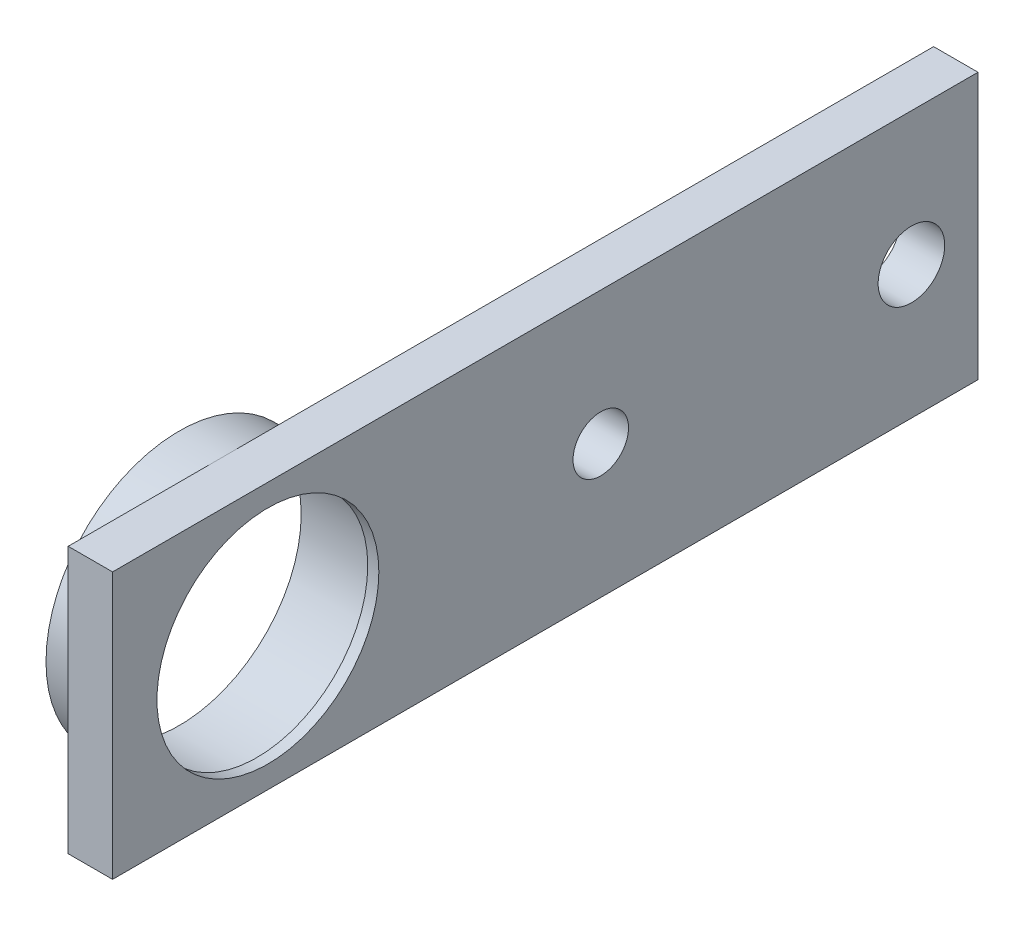
ISO-10303-21;
HEADER;
FILE_DESCRIPTION(('STEP AP214'),'2;1');
FILE_NAME('part.step','',(''),(''),'','','');
FILE_SCHEMA(('AUTOMOTIVE_DESIGN { 1 0 10303 214 1 1 1 1 }'));
ENDSEC;
DATA;
#1=APPLICATION_CONTEXT('core data for automotive mechanical design processes');
#2=APPLICATION_PROTOCOL_DEFINITION('international standard','automotive_design',2000,#1);
#3=PRODUCT_CONTEXT('',#1,'mechanical');
#4=PRODUCT('Part','Part','',(#3));
#5=PRODUCT_RELATED_PRODUCT_CATEGORY('part','',(#4));
#6=PRODUCT_DEFINITION_FORMATION('','',#4);
#7=PRODUCT_DEFINITION_CONTEXT('part definition',#1,'design');
#8=PRODUCT_DEFINITION('design','',#6,#7);
#9=PRODUCT_DEFINITION_SHAPE('','',#8);
#10=(LENGTH_UNIT() NAMED_UNIT(*) SI_UNIT(.MILLI.,.METRE.));
#11=(NAMED_UNIT(*) PLANE_ANGLE_UNIT() SI_UNIT($,.RADIAN.));
#12=(NAMED_UNIT(*) SI_UNIT($,.STERADIAN.) SOLID_ANGLE_UNIT());
#13=UNCERTAINTY_MEASURE_WITH_UNIT(LENGTH_MEASURE(1.E-05),#10,'distance_accuracy_value','');
#14=(GEOMETRIC_REPRESENTATION_CONTEXT(3) GLOBAL_UNCERTAINTY_ASSIGNED_CONTEXT((#13)) GLOBAL_UNIT_ASSIGNED_CONTEXT((#10,
#11,#12)) REPRESENTATION_CONTEXT('',''));
#15=CARTESIAN_POINT('',(0.,0.,0.));
#16=DIRECTION('',(0.,0.,1.));
#17=DIRECTION('',(1.,0.,0.));
#18=AXIS2_PLACEMENT_3D('',#15,#16,#17);
#19=CARTESIAN_POINT('',(0.,0.,0.));
#20=DIRECTION('',(-1.,0.,0.));
#21=DIRECTION('',(0.,0.,1.));
#22=AXIS2_PLACEMENT_3D('',#19,#20,#21);
#23=PLANE('',#22);
#24=CARTESIAN_POINT('',(0.,19.05,-22.225));
#25=DIRECTION('',(-1.,0.,0.));
#26=DIRECTION('',(0.,0.,1.));
#27=AXIS2_PLACEMENT_3D('',#24,#25,#26);
#28=CIRCLE('',#27,19.05);
#29=CARTESIAN_POINT('',(0.,38.1,-22.225));
#30=VERTEX_POINT('',#29);
#31=CARTESIAN_POINT('',(0.,0.,-22.225));
#32=VERTEX_POINT('',#31);
#33=EDGE_CURVE('E43',#30,#32,#28,.T.);
#34=ORIENTED_EDGE('',*,*,#33,.F.);
#35=DIRECTION('',(0.,0.,1.));
#36=VECTOR('',#35,1.);
#37=CARTESIAN_POINT('',(0.,38.1,0.));
#38=LINE('',#37,#36);
#39=CARTESIAN_POINT('',(0.,38.1,-123.825));
#40=VERTEX_POINT('',#39);
#41=EDGE_CURVE('E88',#40,#30,#38,.T.);
#42=ORIENTED_EDGE('',*,*,#41,.F.);
#43=DIRECTION('',(0.,1.,0.));
#44=VECTOR('',#43,1.);
#45=CARTESIAN_POINT('',(0.,0.,-123.825));
#46=LINE('',#45,#44);
#47=CARTESIAN_POINT('',(0.,0.,-123.825));
#48=VERTEX_POINT('',#47);
#49=EDGE_CURVE('E101',#48,#40,#46,.T.);
#50=ORIENTED_EDGE('',*,*,#49,.F.);
#51=DIRECTION('',(0.,0.,-1.));
#52=VECTOR('',#51,1.);
#53=CARTESIAN_POINT('',(0.,0.,0.));
#54=LINE('',#53,#52);
#55=EDGE_CURVE('E104',#32,#48,#54,.T.);
#56=ORIENTED_EDGE('',*,*,#55,.F.);
#57=EDGE_LOOP('',(#34,#42,#50,#56));
#58=FACE_BOUND('',#57,.T.);
#59=CARTESIAN_POINT('',(0.,19.05,-69.85));
#60=DIRECTION('',(1.,0.,0.));
#61=DIRECTION('',(0.,0.,-1.));
#62=AXIS2_PLACEMENT_3D('',#59,#60,#61);
#63=CIRCLE('',#62,3.96874999999999);
#64=CARTESIAN_POINT('',(0.,19.05,-73.81875));
#65=VERTEX_POINT('',#64);
#66=EDGE_CURVE('E179',#65,#65,#63,.T.);
#67=ORIENTED_EDGE('',*,*,#66,.T.);
#68=EDGE_LOOP('',(#67));
#69=FACE_BOUND('',#68,.T.);
#70=CARTESIAN_POINT('',(0.,19.05,-114.3));
#71=DIRECTION('',(1.,0.,0.));
#72=DIRECTION('',(0.,0.,-1.));
#73=AXIS2_PLACEMENT_3D('',#70,#71,#72);
#74=CIRCLE('',#73,4.7625);
#75=CARTESIAN_POINT('',(0.,19.05,-119.0625));
#76=VERTEX_POINT('',#75);
#77=EDGE_CURVE('E175',#76,#76,#74,.T.);
#78=ORIENTED_EDGE('',*,*,#77,.T.);
#79=EDGE_LOOP('',(#78));
#80=FACE_BOUND('',#79,.T.);
#81=ADVANCED_FACE('F33',(#58,#69,#80),#23,.T.);
#82=CARTESIAN_POINT('',(6.35,19.05,-22.225));
#83=DIRECTION('',(-1.,0.,0.));
#84=DIRECTION('',(0.,0.,1.));
#85=AXIS2_PLACEMENT_3D('',#82,#83,#84);
#86=CYLINDRICAL_SURFACE('',#85,17.4625);
#87=CARTESIAN_POINT('',(4.7625,19.05,-22.225));
#88=DIRECTION('',(1.,0.,0.));
#89=DIRECTION('',(0.,0.,-1.));
#90=AXIS2_PLACEMENT_3D('',#87,#88,#89);
#91=CIRCLE('',#90,17.4625);
#92=CARTESIAN_POINT('',(4.7625,19.05,-39.6875));
#93=VERTEX_POINT('',#92);
#94=EDGE_CURVE('E168',#93,#93,#91,.T.);
#95=ORIENTED_EDGE('',*,*,#94,.T.);
#96=EDGE_LOOP('',(#95));
#97=FACE_BOUND('',#96,.T.);
#98=CARTESIAN_POINT('',(-6.35,19.05,-22.225));
#99=DIRECTION('',(-1.,0.,0.));
#100=DIRECTION('',(0.,0.,1.));
#101=AXIS2_PLACEMENT_3D('',#98,#99,#100);
#102=CIRCLE('',#101,17.4625);
#103=CARTESIAN_POINT('',(-6.35,19.05,-4.7625));
#104=VERTEX_POINT('',#103);
#105=EDGE_CURVE('E108',#104,#104,#102,.T.);
#106=ORIENTED_EDGE('',*,*,#105,.T.);
#107=EDGE_LOOP('',(#106));
#108=FACE_BOUND('',#107,.T.);
#109=ADVANCED_FACE('F123',(#97,#108),#86,.F.);
#110=CARTESIAN_POINT('',(6.35,0.,0.));
#111=DIRECTION('',(-1.,0.,0.));
#112=DIRECTION('',(0.,0.,1.));
#113=AXIS2_PLACEMENT_3D('',#110,#111,#112);
#114=PLANE('',#113);
#115=DIRECTION('',(0.,-1.,0.));
#116=VECTOR('',#115,1.);
#117=CARTESIAN_POINT('',(6.35,0.,0.));
#118=LINE('',#117,#116);
#119=CARTESIAN_POINT('',(6.35,38.1,0.));
#120=VERTEX_POINT('',#119);
#121=CARTESIAN_POINT('',(6.35,0.,0.));
#122=VERTEX_POINT('',#121);
#123=EDGE_CURVE('E95',#120,#122,#118,.T.);
#124=ORIENTED_EDGE('',*,*,#123,.T.);
#125=DIRECTION('',(0.,0.,-1.));
#126=VECTOR('',#125,1.);
#127=CARTESIAN_POINT('',(6.35,0.,0.));
#128=LINE('',#127,#126);
#129=CARTESIAN_POINT('',(6.35,0.,-123.825));
#130=VERTEX_POINT('',#129);
#131=EDGE_CURVE('E84',#122,#130,#128,.T.);
#132=ORIENTED_EDGE('',*,*,#131,.T.);
#133=DIRECTION('',(0.,1.,0.));
#134=VECTOR('',#133,1.);
#135=CARTESIAN_POINT('',(6.35,0.,-123.825));
#136=LINE('',#135,#134);
#137=CARTESIAN_POINT('',(6.35,38.1,-123.825));
#138=VERTEX_POINT('',#137);
#139=EDGE_CURVE('E189',#130,#138,#136,.T.);
#140=ORIENTED_EDGE('',*,*,#139,.T.);
#141=DIRECTION('',(0.,0.,1.));
#142=VECTOR('',#141,1.);
#143=CARTESIAN_POINT('',(6.35,38.1,0.));
#144=LINE('',#143,#142);
#145=EDGE_CURVE('E57',#138,#120,#144,.T.);
#146=ORIENTED_EDGE('',*,*,#145,.T.);
#147=EDGE_LOOP('',(#124,#132,#140,#146));
#148=FACE_BOUND('',#147,.T.);
#149=CARTESIAN_POINT('',(6.35,19.05,-69.85));
#150=DIRECTION('',(1.,0.,0.));
#151=DIRECTION('',(0.,0.,-1.));
#152=AXIS2_PLACEMENT_3D('',#149,#150,#151);
#153=CIRCLE('',#152,3.96874999999999);
#154=CARTESIAN_POINT('',(6.35,19.05,-73.81875));
#155=VERTEX_POINT('',#154);
#156=EDGE_CURVE('E182',#155,#155,#153,.T.);
#157=ORIENTED_EDGE('',*,*,#156,.F.);
#158=EDGE_LOOP('',(#157));
#159=FACE_BOUND('',#158,.T.);
#160=CARTESIAN_POINT('',(6.35,19.05,-114.3));
#161=DIRECTION('',(1.,0.,0.));
#162=DIRECTION('',(0.,0.,-1.));
#163=AXIS2_PLACEMENT_3D('',#160,#161,#162);
#164=CIRCLE('',#163,4.7625);
#165=CARTESIAN_POINT('',(6.35,19.05,-119.0625));
#166=VERTEX_POINT('',#165);
#167=EDGE_CURVE('E176',#166,#166,#164,.T.);
#168=ORIENTED_EDGE('',*,*,#167,.F.);
#169=EDGE_LOOP('',(#168));
#170=FACE_BOUND('',#169,.T.);
#171=CARTESIAN_POINT('',(6.35,19.05,-22.225));
#172=DIRECTION('',(1.,0.,0.));
#173=DIRECTION('',(0.,0.,-1.));
#174=AXIS2_PLACEMENT_3D('',#171,#172,#173);
#175=CIRCLE('',#174,15.875);
#176=CARTESIAN_POINT('',(6.35,19.05,-38.1));
#177=VERTEX_POINT('',#176);
#178=EDGE_CURVE('E165',#177,#177,#175,.T.);
#179=ORIENTED_EDGE('',*,*,#178,.F.);
#180=EDGE_LOOP('',(#179));
#181=FACE_BOUND('',#180,.T.);
#182=ADVANCED_FACE('F128',(#148,#159,#170,#181),#114,.F.);
#183=EDGE_CURVE('E11',#32,#30,#28,.T.);
#184=ORIENTED_EDGE('',*,*,#183,.F.);
#185=CARTESIAN_POINT('',(0.,0.,0.));
#186=VERTEX_POINT('',#185);
#187=EDGE_CURVE('E194',#186,#32,#54,.T.);
#188=ORIENTED_EDGE('',*,*,#187,.F.);
#189=DIRECTION('',(0.,-1.,0.));
#190=VECTOR('',#189,1.);
#191=CARTESIAN_POINT('',(0.,0.,0.));
#192=LINE('',#191,#190);
#193=CARTESIAN_POINT('',(0.,38.1,0.));
#194=VERTEX_POINT('',#193);
#195=EDGE_CURVE('E100',#194,#186,#192,.T.);
#196=ORIENTED_EDGE('',*,*,#195,.F.);
#197=EDGE_CURVE('E76',#30,#194,#38,.T.);
#198=ORIENTED_EDGE('',*,*,#197,.F.);
#199=EDGE_LOOP('',(#184,#188,#196,#198));
#200=FACE_BOUND('',#199,.T.);
#201=ADVANCED_FACE('F98',(#200),#23,.T.);
#202=CARTESIAN_POINT('',(6.35,0.,0.));
#203=DIRECTION('',(0.,0.,-1.));
#204=DIRECTION('',(-1.,0.,0.));
#205=AXIS2_PLACEMENT_3D('',#202,#203,#204);
#206=PLANE('',#205);
#207=ORIENTED_EDGE('',*,*,#195,.T.);
#208=DIRECTION('',(-1.,0.,0.));
#209=VECTOR('',#208,1.);
#210=CARTESIAN_POINT('',(6.35,0.,0.));
#211=LINE('',#210,#209);
#212=EDGE_CURVE('E37',#122,#186,#211,.T.);
#213=ORIENTED_EDGE('',*,*,#212,.F.);
#214=ORIENTED_EDGE('',*,*,#123,.F.);
#215=DIRECTION('',(-1.,0.,0.));
#216=VECTOR('',#215,1.);
#217=CARTESIAN_POINT('',(6.35,38.1,0.));
#218=LINE('',#217,#216);
#219=EDGE_CURVE('E192',#120,#194,#218,.T.);
#220=ORIENTED_EDGE('',*,*,#219,.T.);
#221=EDGE_LOOP('',(#207,#213,#214,#220));
#222=FACE_BOUND('',#221,.T.);
#223=ADVANCED_FACE('F35',(#222),#206,.F.);
#224=CARTESIAN_POINT('',(6.35,0.,0.));
#225=DIRECTION('',(0.,1.,0.));
#226=DIRECTION('',(0.,0.,1.));
#227=AXIS2_PLACEMENT_3D('',#224,#225,#226);
#228=PLANE('',#227);
#229=ORIENTED_EDGE('',*,*,#187,.T.);
#230=ORIENTED_EDGE('',*,*,#55,.T.);
#231=DIRECTION('',(-1.,0.,0.));
#232=VECTOR('',#231,1.);
#233=CARTESIAN_POINT('',(6.35,0.,-123.825));
#234=LINE('',#233,#232);
#235=EDGE_CURVE('E198',#130,#48,#234,.T.);
#236=ORIENTED_EDGE('',*,*,#235,.F.);
#237=ORIENTED_EDGE('',*,*,#131,.F.);
#238=ORIENTED_EDGE('',*,*,#212,.T.);
#239=EDGE_LOOP('',(#229,#230,#236,#237,#238));
#240=FACE_BOUND('',#239,.T.);
#241=ADVANCED_FACE('F138',(#240),#228,.F.);
#242=CARTESIAN_POINT('',(6.35,0.,-123.825));
#243=DIRECTION('',(0.,0.,1.));
#244=DIRECTION('',(1.,0.,0.));
#245=AXIS2_PLACEMENT_3D('',#242,#243,#244);
#246=PLANE('',#245);
#247=ORIENTED_EDGE('',*,*,#49,.T.);
#248=DIRECTION('',(-1.,0.,0.));
#249=VECTOR('',#248,1.);
#250=CARTESIAN_POINT('',(6.35,38.1,-123.825));
#251=LINE('',#250,#249);
#252=EDGE_CURVE('E91',#138,#40,#251,.T.);
#253=ORIENTED_EDGE('',*,*,#252,.F.);
#254=ORIENTED_EDGE('',*,*,#139,.F.);
#255=ORIENTED_EDGE('',*,*,#235,.T.);
#256=EDGE_LOOP('',(#247,#253,#254,#255));
#257=FACE_BOUND('',#256,.T.);
#258=ADVANCED_FACE('F204',(#257),#246,.F.);
#259=CARTESIAN_POINT('',(6.35,38.1,0.));
#260=DIRECTION('',(0.,-1.,0.));
#261=DIRECTION('',(0.,0.,-1.));
#262=AXIS2_PLACEMENT_3D('',#259,#260,#261);
#263=PLANE('',#262);
#264=ORIENTED_EDGE('',*,*,#41,.T.);
#265=ORIENTED_EDGE('',*,*,#197,.T.);
#266=ORIENTED_EDGE('',*,*,#219,.F.);
#267=ORIENTED_EDGE('',*,*,#145,.F.);
#268=ORIENTED_EDGE('',*,*,#252,.T.);
#269=EDGE_LOOP('',(#264,#265,#266,#267,#268));
#270=FACE_BOUND('',#269,.T.);
#271=ADVANCED_FACE('F89',(#270),#263,.F.);
#272=CARTESIAN_POINT('',(6.35,19.05,-69.85));
#273=DIRECTION('',(-1.,0.,0.));
#274=DIRECTION('',(0.,0.,1.));
#275=AXIS2_PLACEMENT_3D('',#272,#273,#274);
#276=CYLINDRICAL_SURFACE('',#275,3.96874999999999);
#277=ORIENTED_EDGE('',*,*,#156,.T.);
#278=EDGE_LOOP('',(#277));
#279=FACE_BOUND('',#278,.T.);
#280=ORIENTED_EDGE('',*,*,#66,.F.);
#281=EDGE_LOOP('',(#280));
#282=FACE_BOUND('',#281,.T.);
#283=ADVANCED_FACE('F144',(#279,#282),#276,.F.);
#284=CARTESIAN_POINT('',(6.35,19.05,-114.3));
#285=DIRECTION('',(-1.,0.,0.));
#286=DIRECTION('',(0.,0.,1.));
#287=AXIS2_PLACEMENT_3D('',#284,#285,#286);
#288=CYLINDRICAL_SURFACE('',#287,4.7625);
#289=ORIENTED_EDGE('',*,*,#167,.T.);
#290=EDGE_LOOP('',(#289));
#291=FACE_BOUND('',#290,.T.);
#292=ORIENTED_EDGE('',*,*,#77,.F.);
#293=EDGE_LOOP('',(#292));
#294=FACE_BOUND('',#293,.T.);
#295=ADVANCED_FACE('F147',(#291,#294),#288,.F.);
#296=CARTESIAN_POINT('',(4.7625,19.05,-22.225));
#297=DIRECTION('',(1.,0.,0.));
#298=DIRECTION('',(0.,0.,-1.));
#299=AXIS2_PLACEMENT_3D('',#296,#297,#298);
#300=PLANE('',#299);
#301=CARTESIAN_POINT('',(4.7625,19.05,-22.225));
#302=DIRECTION('',(1.,0.,0.));
#303=DIRECTION('',(0.,0.,-1.));
#304=AXIS2_PLACEMENT_3D('',#301,#302,#303);
#305=CIRCLE('',#304,15.875);
#306=CARTESIAN_POINT('',(4.7625,19.05,-38.1));
#307=VERTEX_POINT('',#306);
#308=EDGE_CURVE('E162',#307,#307,#305,.T.);
#309=ORIENTED_EDGE('',*,*,#308,.T.);
#310=EDGE_LOOP('',(#309));
#311=FACE_BOUND('',#310,.T.);
#312=ORIENTED_EDGE('',*,*,#94,.F.);
#313=EDGE_LOOP('',(#312));
#314=FACE_BOUND('',#313,.T.);
#315=ADVANCED_FACE('F151',(#311,#314),#300,.F.);
#316=CARTESIAN_POINT('',(4.7625,19.05,-22.225));
#317=DIRECTION('',(1.,0.,0.));
#318=DIRECTION('',(0.,0.,-1.));
#319=AXIS2_PLACEMENT_3D('',#316,#317,#318);
#320=CYLINDRICAL_SURFACE('',#319,15.875);
#321=ORIENTED_EDGE('',*,*,#308,.F.);
#322=EDGE_LOOP('',(#321));
#323=FACE_BOUND('',#322,.T.);
#324=ORIENTED_EDGE('',*,*,#178,.T.);
#325=EDGE_LOOP('',(#324));
#326=FACE_BOUND('',#325,.T.);
#327=ADVANCED_FACE('F117',(#323,#326),#320,.F.);
#328=CARTESIAN_POINT('',(-6.35,19.05,-22.225));
#329=DIRECTION('',(-1.,0.,0.));
#330=DIRECTION('',(0.,0.,1.));
#331=AXIS2_PLACEMENT_3D('',#328,#329,#330);
#332=PLANE('',#331);
#333=CARTESIAN_POINT('',(-6.35,19.05,-22.225));
#334=DIRECTION('',(-1.,0.,0.));
#335=DIRECTION('',(0.,0.,1.));
#336=AXIS2_PLACEMENT_3D('',#333,#334,#335);
#337=CIRCLE('',#336,19.05);
#338=CARTESIAN_POINT('',(-6.35,19.05,-3.175));
#339=VERTEX_POINT('',#338);
#340=EDGE_CURVE('E107',#339,#339,#337,.T.);
#341=ORIENTED_EDGE('',*,*,#340,.T.);
#342=EDGE_LOOP('',(#341));
#343=FACE_BOUND('',#342,.T.);
#344=ORIENTED_EDGE('',*,*,#105,.F.);
#345=EDGE_LOOP('',(#344));
#346=FACE_BOUND('',#345,.T.);
#347=ADVANCED_FACE('F111',(#343,#346),#332,.T.);
#348=CARTESIAN_POINT('',(-6.35,19.05,-22.225));
#349=DIRECTION('',(1.,0.,0.));
#350=DIRECTION('',(0.,0.,-1.));
#351=AXIS2_PLACEMENT_3D('',#348,#349,#350);
#352=CYLINDRICAL_SURFACE('',#351,19.05);
#353=ORIENTED_EDGE('',*,*,#340,.F.);
#354=EDGE_LOOP('',(#353));
#355=FACE_BOUND('',#354,.T.);
#356=ORIENTED_EDGE('',*,*,#33,.T.);
#357=ORIENTED_EDGE('',*,*,#183,.T.);
#358=EDGE_LOOP('',(#356,#357));
#359=FACE_BOUND('',#358,.T.);
#360=ADVANCED_FACE('F109',(#355,#359),#352,.T.);
#361=CLOSED_SHELL('',(#81,#109,#182,#201,#223,#241,#258,#271,#283,#295,#315,#327,#347,#360));
#362=MANIFOLD_SOLID_BREP('B2',#361);
#363=ADVANCED_BREP_SHAPE_REPRESENTATION('',(#18,#362),#14);
#364=SHAPE_DEFINITION_REPRESENTATION(#9,#363);
ENDSEC;
END-ISO-10303-21;
